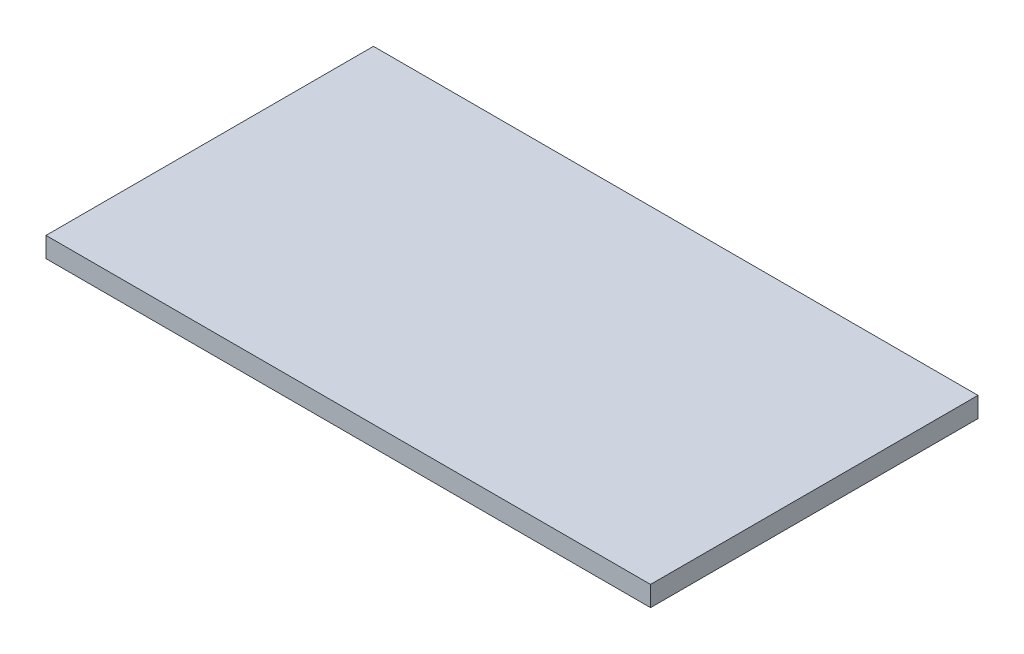
ISO-10303-21;
HEADER;
FILE_DESCRIPTION(('STEP AP214'),'2;1');
FILE_NAME('part.step','',(''),(''),'','','');
FILE_SCHEMA(('AUTOMOTIVE_DESIGN { 1 0 10303 214 1 1 1 1 }'));
ENDSEC;
DATA;
#1=APPLICATION_CONTEXT('core data for automotive mechanical design processes');
#2=APPLICATION_PROTOCOL_DEFINITION('international standard','automotive_design',2000,#1);
#3=PRODUCT_CONTEXT('',#1,'mechanical');
#4=PRODUCT('Part','Part','',(#3));
#5=PRODUCT_RELATED_PRODUCT_CATEGORY('part','',(#4));
#6=PRODUCT_DEFINITION_FORMATION('','',#4);
#7=PRODUCT_DEFINITION_CONTEXT('part definition',#1,'design');
#8=PRODUCT_DEFINITION('design','',#6,#7);
#9=PRODUCT_DEFINITION_SHAPE('','',#8);
#10=(LENGTH_UNIT() NAMED_UNIT(*) SI_UNIT(.MILLI.,.METRE.));
#11=(NAMED_UNIT(*) PLANE_ANGLE_UNIT() SI_UNIT($,.RADIAN.));
#12=(NAMED_UNIT(*) SI_UNIT($,.STERADIAN.) SOLID_ANGLE_UNIT());
#13=UNCERTAINTY_MEASURE_WITH_UNIT(LENGTH_MEASURE(1.E-05),#10,'distance_accuracy_value','');
#14=(GEOMETRIC_REPRESENTATION_CONTEXT(3) GLOBAL_UNCERTAINTY_ASSIGNED_CONTEXT((#13)) GLOBAL_UNIT_ASSIGNED_CONTEXT((#10,
#11,#12)) REPRESENTATION_CONTEXT('',''));
#15=CARTESIAN_POINT('',(0.,0.,0.));
#16=DIRECTION('',(0.,0.,1.));
#17=DIRECTION('',(1.,0.,0.));
#18=AXIS2_PLACEMENT_3D('',#15,#16,#17);
#19=CARTESIAN_POINT('',(-60.,4.,32.5));
#20=DIRECTION('',(1.,0.,0.));
#21=DIRECTION('',(0.,0.,-1.));
#22=AXIS2_PLACEMENT_3D('',#19,#20,#21);
#23=PLANE('',#22);
#24=DIRECTION('',(0.,0.,1.));
#25=VECTOR('',#24,1.);
#26=CARTESIAN_POINT('',(-60.,0.,32.5));
#27=LINE('',#26,#25);
#28=CARTESIAN_POINT('',(-60.,0.,-32.5));
#29=VERTEX_POINT('',#28);
#30=CARTESIAN_POINT('',(-60.,0.,32.5));
#31=VERTEX_POINT('',#30);
#32=EDGE_CURVE('E96',#29,#31,#27,.T.);
#33=ORIENTED_EDGE('',*,*,#32,.T.);
#34=DIRECTION('',(0.,-1.,0.));
#35=VECTOR('',#34,1.);
#36=CARTESIAN_POINT('',(-60.,4.,32.5));
#37=LINE('',#36,#35);
#38=CARTESIAN_POINT('',(-60.,4.,32.5));
#39=VERTEX_POINT('',#38);
#40=EDGE_CURVE('E11',#39,#31,#37,.T.);
#41=ORIENTED_EDGE('',*,*,#40,.F.);
#42=DIRECTION('',(0.,0.,1.));
#43=VECTOR('',#42,1.);
#44=CARTESIAN_POINT('',(-60.,4.,32.5));
#45=LINE('',#44,#43);
#46=CARTESIAN_POINT('',(-60.,4.,-32.5));
#47=VERTEX_POINT('',#46);
#48=EDGE_CURVE('E84',#47,#39,#45,.T.);
#49=ORIENTED_EDGE('',*,*,#48,.F.);
#50=DIRECTION('',(0.,-1.,0.));
#51=VECTOR('',#50,1.);
#52=CARTESIAN_POINT('',(-60.,4.,-32.5));
#53=LINE('',#52,#51);
#54=EDGE_CURVE('E92',#47,#29,#53,.T.);
#55=ORIENTED_EDGE('',*,*,#54,.T.);
#56=EDGE_LOOP('',(#33,#41,#49,#55));
#57=FACE_BOUND('',#56,.T.);
#58=ADVANCED_FACE('F33',(#57),#23,.F.);
#59=CARTESIAN_POINT('',(60.,4.,32.5));
#60=DIRECTION('',(0.,0.,-1.));
#61=DIRECTION('',(-1.,0.,0.));
#62=AXIS2_PLACEMENT_3D('',#59,#60,#61);
#63=PLANE('',#62);
#64=DIRECTION('',(1.,0.,0.));
#65=VECTOR('',#64,1.);
#66=CARTESIAN_POINT('',(60.,0.,32.5));
#67=LINE('',#66,#65);
#68=CARTESIAN_POINT('',(60.,0.,32.5));
#69=VERTEX_POINT('',#68);
#70=EDGE_CURVE('E88',#31,#69,#67,.T.);
#71=ORIENTED_EDGE('',*,*,#70,.T.);
#72=DIRECTION('',(0.,-1.,0.));
#73=VECTOR('',#72,1.);
#74=CARTESIAN_POINT('',(60.,4.,32.5));
#75=LINE('',#74,#73);
#76=CARTESIAN_POINT('',(60.,4.,32.5));
#77=VERTEX_POINT('',#76);
#78=EDGE_CURVE('E41',#77,#69,#75,.T.);
#79=ORIENTED_EDGE('',*,*,#78,.F.);
#80=DIRECTION('',(1.,0.,0.));
#81=VECTOR('',#80,1.);
#82=CARTESIAN_POINT('',(60.,4.,32.5));
#83=LINE('',#82,#81);
#84=EDGE_CURVE('E79',#39,#77,#83,.T.);
#85=ORIENTED_EDGE('',*,*,#84,.F.);
#86=ORIENTED_EDGE('',*,*,#40,.T.);
#87=EDGE_LOOP('',(#71,#79,#85,#86));
#88=FACE_BOUND('',#87,.T.);
#89=ADVANCED_FACE('F87',(#88),#63,.F.);
#90=CARTESIAN_POINT('',(60.,4.,32.5));
#91=DIRECTION('',(-1.,0.,0.));
#92=DIRECTION('',(0.,0.,1.));
#93=AXIS2_PLACEMENT_3D('',#90,#91,#92);
#94=PLANE('',#93);
#95=DIRECTION('',(0.,0.,-1.));
#96=VECTOR('',#95,1.);
#97=CARTESIAN_POINT('',(60.,0.,32.5));
#98=LINE('',#97,#96);
#99=CARTESIAN_POINT('',(60.,0.,-32.5));
#100=VERTEX_POINT('',#99);
#101=EDGE_CURVE('E66',#69,#100,#98,.T.);
#102=ORIENTED_EDGE('',*,*,#101,.T.);
#103=DIRECTION('',(0.,-1.,0.));
#104=VECTOR('',#103,1.);
#105=CARTESIAN_POINT('',(60.,4.,-32.5));
#106=LINE('',#105,#104);
#107=CARTESIAN_POINT('',(60.,4.,-32.5));
#108=VERTEX_POINT('',#107);
#109=EDGE_CURVE('E89',#108,#100,#106,.T.);
#110=ORIENTED_EDGE('',*,*,#109,.F.);
#111=DIRECTION('',(0.,0.,-1.));
#112=VECTOR('',#111,1.);
#113=CARTESIAN_POINT('',(60.,4.,32.5));
#114=LINE('',#113,#112);
#115=EDGE_CURVE('E82',#77,#108,#114,.T.);
#116=ORIENTED_EDGE('',*,*,#115,.F.);
#117=ORIENTED_EDGE('',*,*,#78,.T.);
#118=EDGE_LOOP('',(#102,#110,#116,#117));
#119=FACE_BOUND('',#118,.T.);
#120=ADVANCED_FACE('F90',(#119),#94,.F.);
#121=CARTESIAN_POINT('',(60.,4.,-32.5));
#122=DIRECTION('',(0.,0.,1.));
#123=DIRECTION('',(1.,0.,0.));
#124=AXIS2_PLACEMENT_3D('',#121,#122,#123);
#125=PLANE('',#124);
#126=DIRECTION('',(-1.,0.,0.));
#127=VECTOR('',#126,1.);
#128=CARTESIAN_POINT('',(60.,0.,-32.5));
#129=LINE('',#128,#127);
#130=EDGE_CURVE('E72',#100,#29,#129,.T.);
#131=ORIENTED_EDGE('',*,*,#130,.T.);
#132=ORIENTED_EDGE('',*,*,#54,.F.);
#133=DIRECTION('',(-1.,0.,0.));
#134=VECTOR('',#133,1.);
#135=CARTESIAN_POINT('',(60.,4.,-32.5));
#136=LINE('',#135,#134);
#137=EDGE_CURVE('E49',#108,#47,#136,.T.);
#138=ORIENTED_EDGE('',*,*,#137,.F.);
#139=ORIENTED_EDGE('',*,*,#109,.T.);
#140=EDGE_LOOP('',(#131,#132,#138,#139));
#141=FACE_BOUND('',#140,.T.);
#142=ADVANCED_FACE('F103',(#141),#125,.F.);
#143=CARTESIAN_POINT('',(0.,4.,0.));
#144=DIRECTION('',(0.,1.,0.));
#145=DIRECTION('',(0.,0.,1.));
#146=AXIS2_PLACEMENT_3D('',#143,#144,#145);
#147=PLANE('',#146);
#148=ORIENTED_EDGE('',*,*,#48,.T.);
#149=ORIENTED_EDGE('',*,*,#84,.T.);
#150=ORIENTED_EDGE('',*,*,#115,.T.);
#151=ORIENTED_EDGE('',*,*,#137,.T.);
#152=EDGE_LOOP('',(#148,#149,#150,#151));
#153=FACE_BOUND('',#152,.T.);
#154=ADVANCED_FACE('F80',(#153),#147,.T.);
#155=CARTESIAN_POINT('',(0.,0.,0.));
#156=DIRECTION('',(0.,1.,0.));
#157=DIRECTION('',(0.,0.,1.));
#158=AXIS2_PLACEMENT_3D('',#155,#156,#157);
#159=PLANE('',#158);
#160=ORIENTED_EDGE('',*,*,#32,.F.);
#161=ORIENTED_EDGE('',*,*,#130,.F.);
#162=ORIENTED_EDGE('',*,*,#101,.F.);
#163=ORIENTED_EDGE('',*,*,#70,.F.);
#164=EDGE_LOOP('',(#160,#161,#162,#163));
#165=FACE_BOUND('',#164,.T.);
#166=ADVANCED_FACE('F106',(#165),#159,.F.);
#167=CLOSED_SHELL('',(#58,#89,#120,#142,#154,#166));
#168=MANIFOLD_SOLID_BREP('B2',#167);
#169=ADVANCED_BREP_SHAPE_REPRESENTATION('',(#18,#168),#14);
#170=SHAPE_DEFINITION_REPRESENTATION(#9,#169);
ENDSEC;
END-ISO-10303-21;
